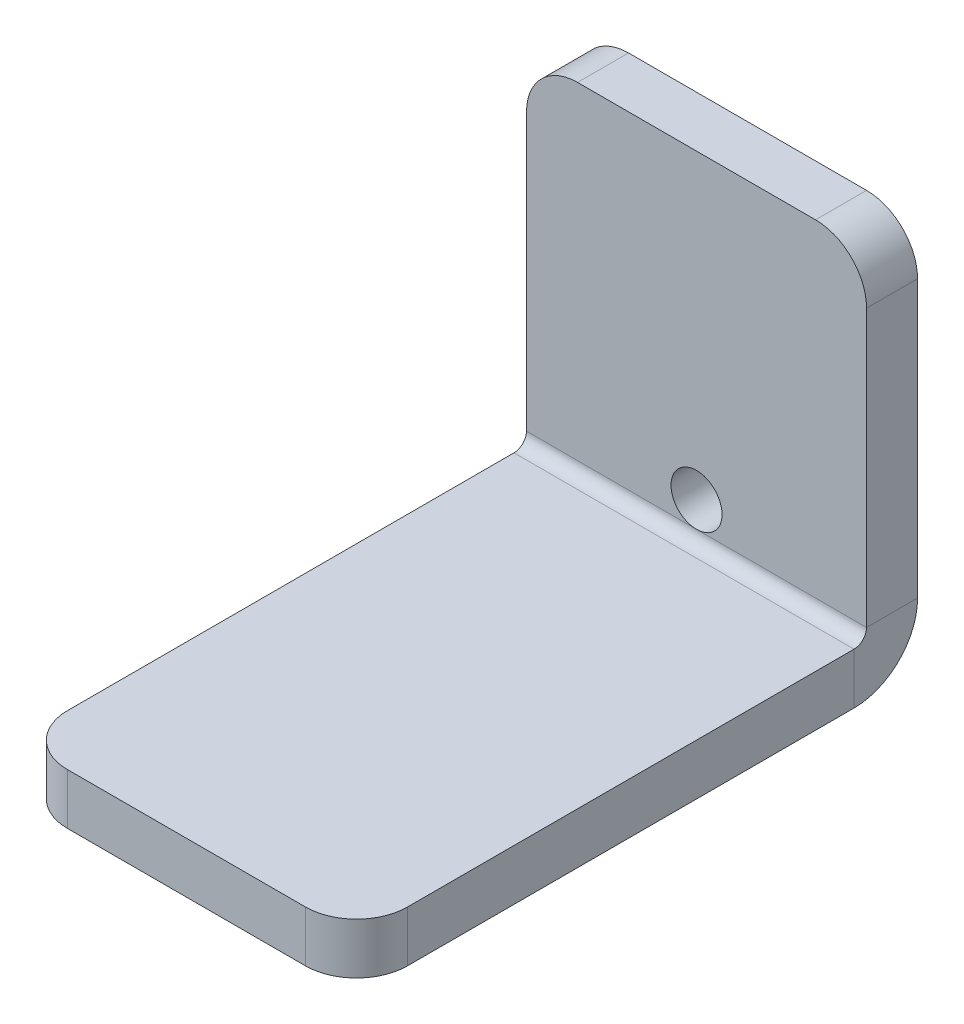
ISO-10303-21;
HEADER;
FILE_DESCRIPTION(('STEP AP214'),'2;1');
FILE_NAME('part.step','',(''),(''),'','','');
FILE_SCHEMA(('AUTOMOTIVE_DESIGN { 1 0 10303 214 1 1 1 1 }'));
ENDSEC;
DATA;
#1=APPLICATION_CONTEXT('core data for automotive mechanical design processes');
#2=APPLICATION_PROTOCOL_DEFINITION('international standard','automotive_design',2000,#1);
#3=PRODUCT_CONTEXT('',#1,'mechanical');
#4=PRODUCT('Part','Part','',(#3));
#5=PRODUCT_RELATED_PRODUCT_CATEGORY('part','',(#4));
#6=PRODUCT_DEFINITION_FORMATION('','',#4);
#7=PRODUCT_DEFINITION_CONTEXT('part definition',#1,'design');
#8=PRODUCT_DEFINITION('design','',#6,#7);
#9=PRODUCT_DEFINITION_SHAPE('','',#8);
#10=(LENGTH_UNIT() NAMED_UNIT(*) SI_UNIT(.MILLI.,.METRE.));
#11=(NAMED_UNIT(*) PLANE_ANGLE_UNIT() SI_UNIT($,.RADIAN.));
#12=(NAMED_UNIT(*) SI_UNIT($,.STERADIAN.) SOLID_ANGLE_UNIT());
#13=UNCERTAINTY_MEASURE_WITH_UNIT(LENGTH_MEASURE(1.E-05),#10,'distance_accuracy_value','');
#14=(GEOMETRIC_REPRESENTATION_CONTEXT(3) GLOBAL_UNCERTAINTY_ASSIGNED_CONTEXT((#13)) GLOBAL_UNIT_ASSIGNED_CONTEXT((#10,
#11,#12)) REPRESENTATION_CONTEXT('',''));
#15=CARTESIAN_POINT('',(0.,0.,0.));
#16=DIRECTION('',(0.,0.,1.));
#17=DIRECTION('',(1.,0.,0.));
#18=AXIS2_PLACEMENT_3D('',#15,#16,#17);
#19=CARTESIAN_POINT('',(20.,0.7366,-30.));
#20=DIRECTION('',(1.,0.,0.));
#21=DIRECTION('',(0.,0.,-1.));
#22=AXIS2_PLACEMENT_3D('',#19,#20,#21);
#23=PLANE('',#22);
#24=DIRECTION('',(0.,0.,-1.));
#25=VECTOR('',#24,1.);
#26=CARTESIAN_POINT('',(20.,0.7366,-30.));
#27=LINE('',#26,#25);
#28=CARTESIAN_POINT('',(20.,0.7366,-30.));
#29=VERTEX_POINT('',#28);
#30=CARTESIAN_POINT('',(20.,0.7366,-33.));
#31=VERTEX_POINT('',#30);
#32=EDGE_CURVE('E138',#29,#31,#27,.T.);
#33=ORIENTED_EDGE('',*,*,#32,.F.);
#34=CARTESIAN_POINT('',(20.,0.7366,-29.2634));
#35=DIRECTION('',(-1.,0.,0.));
#36=DIRECTION('',(0.,0.,1.));
#37=AXIS2_PLACEMENT_3D('',#34,#35,#36);
#38=CIRCLE('',#37,0.7366);
#39=CARTESIAN_POINT('',(20.,0.,-29.2634));
#40=VERTEX_POINT('',#39);
#41=EDGE_CURVE('E142',#40,#29,#38,.F.);
#42=ORIENTED_EDGE('',*,*,#41,.F.);
#43=DIRECTION('',(0.,1.,0.));
#44=VECTOR('',#43,1.);
#45=CARTESIAN_POINT('',(20.,-3.,-29.2634));
#46=LINE('',#45,#44);
#47=CARTESIAN_POINT('',(20.,-3.,-29.2634));
#48=VERTEX_POINT('',#47);
#49=EDGE_CURVE('E151',#48,#40,#46,.T.);
#50=ORIENTED_EDGE('',*,*,#49,.F.);
#51=CARTESIAN_POINT('',(20.,0.7366,-29.2634));
#52=DIRECTION('',(1.,0.,0.));
#53=DIRECTION('',(0.,0.,-1.));
#54=AXIS2_PLACEMENT_3D('',#51,#52,#53);
#55=CIRCLE('',#54,3.7366);
#56=EDGE_CURVE('E144',#48,#31,#55,.T.);
#57=ORIENTED_EDGE('',*,*,#56,.T.);
#58=EDGE_LOOP('',(#33,#42,#50,#57));
#59=FACE_BOUND('',#58,.T.);
#60=ADVANCED_FACE('F45',(#59),#23,.T.);
#61=CARTESIAN_POINT('',(20.,-3.,-29.2634));
#62=DIRECTION('',(1.,0.,0.));
#63=DIRECTION('',(0.,0.,-1.));
#64=AXIS2_PLACEMENT_3D('',#61,#62,#63);
#65=PLANE('',#64);
#66=DIRECTION('',(0.,1.,0.));
#67=VECTOR('',#66,1.);
#68=CARTESIAN_POINT('',(20.,0.,-33.));
#69=LINE('',#68,#67);
#70=CARTESIAN_POINT('',(20.,17.,-33.));
#71=VERTEX_POINT('',#70);
#72=EDGE_CURVE('E169',#31,#71,#69,.T.);
#73=ORIENTED_EDGE('',*,*,#72,.T.);
#74=DIRECTION('',(0.,0.,-1.));
#75=VECTOR('',#74,1.);
#76=CARTESIAN_POINT('',(20.,17.,-29.2634));
#77=LINE('',#76,#75);
#78=CARTESIAN_POINT('',(20.,17.,-30.));
#79=VERTEX_POINT('',#78);
#80=EDGE_CURVE('E11',#71,#79,#77,.F.);
#81=ORIENTED_EDGE('',*,*,#80,.T.);
#82=DIRECTION('',(0.,1.,0.));
#83=VECTOR('',#82,1.);
#84=CARTESIAN_POINT('',(20.,0.,-30.));
#85=LINE('',#84,#83);
#86=EDGE_CURVE('E159',#29,#79,#85,.T.);
#87=ORIENTED_EDGE('',*,*,#86,.F.);
#88=ORIENTED_EDGE('',*,*,#32,.T.);
#89=EDGE_LOOP('',(#73,#81,#87,#88));
#90=FACE_BOUND('',#89,.T.);
#91=ADVANCED_FACE('F166',(#90),#65,.T.);
#92=CARTESIAN_POINT('',(0.,0.,-29.2634));
#93=DIRECTION('',(-1.,0.,0.));
#94=DIRECTION('',(0.,0.,1.));
#95=AXIS2_PLACEMENT_3D('',#92,#93,#94);
#96=PLANE('',#95);
#97=DIRECTION('',(0.,-1.,0.));
#98=VECTOR('',#97,1.);
#99=CARTESIAN_POINT('',(0.,0.,-29.2634));
#100=LINE('',#99,#98);
#101=CARTESIAN_POINT('',(0.,0.,-29.2634));
#102=VERTEX_POINT('',#101);
#103=CARTESIAN_POINT('',(0.,-3.,-29.2634));
#104=VERTEX_POINT('',#103);
#105=EDGE_CURVE('E240',#102,#104,#100,.T.);
#106=ORIENTED_EDGE('',*,*,#105,.F.);
#107=CARTESIAN_POINT('',(0.,0.7366,-29.2634));
#108=DIRECTION('',(-1.,0.,0.));
#109=DIRECTION('',(0.,0.,1.));
#110=AXIS2_PLACEMENT_3D('',#107,#108,#109);
#111=CIRCLE('',#110,0.7366);
#112=CARTESIAN_POINT('',(0.,0.7366,-30.));
#113=VERTEX_POINT('',#112);
#114=EDGE_CURVE('E197',#102,#113,#111,.F.);
#115=ORIENTED_EDGE('',*,*,#114,.T.);
#116=DIRECTION('',(0.,0.,1.));
#117=VECTOR('',#116,1.);
#118=CARTESIAN_POINT('',(0.,0.7366,-33.));
#119=LINE('',#118,#117);
#120=CARTESIAN_POINT('',(0.,0.7366,-33.));
#121=VERTEX_POINT('',#120);
#122=EDGE_CURVE('E236',#121,#113,#119,.T.);
#123=ORIENTED_EDGE('',*,*,#122,.F.);
#124=CARTESIAN_POINT('',(0.,0.7366,-29.2634));
#125=DIRECTION('',(1.,0.,0.));
#126=DIRECTION('',(0.,0.,-1.));
#127=AXIS2_PLACEMENT_3D('',#124,#125,#126);
#128=CIRCLE('',#127,3.7366);
#129=EDGE_CURVE('E207',#104,#121,#128,.T.);
#130=ORIENTED_EDGE('',*,*,#129,.F.);
#131=EDGE_LOOP('',(#106,#115,#123,#130));
#132=FACE_BOUND('',#131,.T.);
#133=ADVANCED_FACE('F327',(#132),#96,.T.);
#134=CARTESIAN_POINT('',(0.,0.7366,-33.));
#135=DIRECTION('',(-1.,0.,0.));
#136=DIRECTION('',(0.,0.,1.));
#137=AXIS2_PLACEMENT_3D('',#134,#135,#136);
#138=PLANE('',#137);
#139=DIRECTION('',(0.,0.,-1.));
#140=VECTOR('',#139,1.);
#141=CARTESIAN_POINT('',(0.,-3.,0.));
#142=LINE('',#141,#140);
#143=CARTESIAN_POINT('',(0.,-3.,-3.));
#144=VERTEX_POINT('',#143);
#145=EDGE_CURVE('E204',#144,#104,#142,.T.);
#146=ORIENTED_EDGE('',*,*,#145,.F.);
#147=DIRECTION('',(0.,1.,0.));
#148=VECTOR('',#147,1.);
#149=CARTESIAN_POINT('',(0.,0.7366,-3.));
#150=LINE('',#149,#148);
#151=CARTESIAN_POINT('',(0.,0.,-3.));
#152=VERTEX_POINT('',#151);
#153=EDGE_CURVE('E269',#144,#152,#150,.T.);
#154=ORIENTED_EDGE('',*,*,#153,.T.);
#155=DIRECTION('',(0.,0.,-1.));
#156=VECTOR('',#155,1.);
#157=CARTESIAN_POINT('',(0.,0.,0.));
#158=LINE('',#157,#156);
#159=EDGE_CURVE('E201',#152,#102,#158,.T.);
#160=ORIENTED_EDGE('',*,*,#159,.T.);
#161=ORIENTED_EDGE('',*,*,#105,.T.);
#162=EDGE_LOOP('',(#146,#154,#160,#161));
#163=FACE_BOUND('',#162,.T.);
#164=ADVANCED_FACE('F318',(#163),#138,.T.);
#165=CARTESIAN_POINT('',(20.,0.,-33.));
#166=DIRECTION('',(0.,0.,1.));
#167=DIRECTION('',(1.,0.,0.));
#168=AXIS2_PLACEMENT_3D('',#165,#166,#167);
#169=PLANE('',#168);
#170=DIRECTION('',(-1.,0.,0.));
#171=VECTOR('',#170,1.);
#172=CARTESIAN_POINT('',(20.,0.7366,-33.));
#173=LINE('',#172,#171);
#174=CARTESIAN_POINT('',(10.,0.7366,-33.));
#175=VERTEX_POINT('',#174);
#176=EDGE_CURVE('E211',#31,#175,#173,.T.);
#177=ORIENTED_EDGE('',*,*,#176,.T.);
#178=CARTESIAN_POINT('',(10.,2.2366,-33.));
#179=DIRECTION('',(0.,0.,-1.));
#180=DIRECTION('',(-1.,0.,0.));
#181=AXIS2_PLACEMENT_3D('',#178,#179,#180);
#182=CIRCLE('',#181,1.5);
#183=EDGE_CURVE('E64',#175,#175,#182,.T.);
#184=ORIENTED_EDGE('',*,*,#183,.F.);
#185=EDGE_CURVE('E188',#175,#121,#173,.T.);
#186=ORIENTED_EDGE('',*,*,#185,.T.);
#187=DIRECTION('',(0.,1.,0.));
#188=VECTOR('',#187,1.);
#189=CARTESIAN_POINT('',(0.,0.,-33.));
#190=LINE('',#189,#188);
#191=CARTESIAN_POINT('',(0.,17.,-33.));
#192=VERTEX_POINT('',#191);
#193=EDGE_CURVE('E189',#121,#192,#190,.T.);
#194=ORIENTED_EDGE('',*,*,#193,.T.);
#195=CARTESIAN_POINT('',(3.,17.,-33.));
#196=DIRECTION('',(0.,0.,1.));
#197=DIRECTION('',(1.,0.,0.));
#198=AXIS2_PLACEMENT_3D('',#195,#196,#197);
#199=CIRCLE('',#198,3.);
#200=CARTESIAN_POINT('',(3.,20.,-33.));
#201=VERTEX_POINT('',#200);
#202=EDGE_CURVE('E253',#192,#201,#199,.F.);
#203=ORIENTED_EDGE('',*,*,#202,.T.);
#204=DIRECTION('',(-1.,0.,0.));
#205=VECTOR('',#204,1.);
#206=CARTESIAN_POINT('',(20.,20.,-33.));
#207=LINE('',#206,#205);
#208=CARTESIAN_POINT('',(17.,20.,-33.));
#209=VERTEX_POINT('',#208);
#210=EDGE_CURVE('E232',#209,#201,#207,.T.);
#211=ORIENTED_EDGE('',*,*,#210,.F.);
#212=CARTESIAN_POINT('',(17.,17.,-33.));
#213=DIRECTION('',(0.,0.,1.));
#214=DIRECTION('',(1.,0.,0.));
#215=AXIS2_PLACEMENT_3D('',#212,#213,#214);
#216=CIRCLE('',#215,3.);
#217=EDGE_CURVE('E250',#209,#71,#216,.F.);
#218=ORIENTED_EDGE('',*,*,#217,.T.);
#219=ORIENTED_EDGE('',*,*,#72,.F.);
#220=EDGE_LOOP('',(#177,#184,#186,#194,#203,#211,#218,#219));
#221=FACE_BOUND('',#220,.T.);
#222=ADVANCED_FACE('F338',(#221),#169,.F.);
#223=CARTESIAN_POINT('',(20.,20.,-30.));
#224=DIRECTION('',(0.,1.,0.));
#225=DIRECTION('',(0.,0.,1.));
#226=AXIS2_PLACEMENT_3D('',#223,#224,#225);
#227=PLANE('',#226);
#228=ORIENTED_EDGE('',*,*,#210,.T.);
#229=DIRECTION('',(0.,0.,-1.));
#230=VECTOR('',#229,1.);
#231=CARTESIAN_POINT('',(3.,20.,-30.));
#232=LINE('',#231,#230);
#233=CARTESIAN_POINT('',(3.,20.,-30.));
#234=VERTEX_POINT('',#233);
#235=EDGE_CURVE('E260',#201,#234,#232,.F.);
#236=ORIENTED_EDGE('',*,*,#235,.T.);
#237=DIRECTION('',(-1.,0.,0.));
#238=VECTOR('',#237,1.);
#239=CARTESIAN_POINT('',(20.,20.,-30.));
#240=LINE('',#239,#238);
#241=CARTESIAN_POINT('',(17.,20.,-30.));
#242=VERTEX_POINT('',#241);
#243=EDGE_CURVE('E163',#242,#234,#240,.T.);
#244=ORIENTED_EDGE('',*,*,#243,.F.);
#245=DIRECTION('',(0.,0.,-1.));
#246=VECTOR('',#245,1.);
#247=CARTESIAN_POINT('',(17.,20.,-30.));
#248=LINE('',#247,#246);
#249=EDGE_CURVE('E256',#242,#209,#248,.T.);
#250=ORIENTED_EDGE('',*,*,#249,.T.);
#251=EDGE_LOOP('',(#228,#236,#244,#250));
#252=FACE_BOUND('',#251,.T.);
#253=ADVANCED_FACE('F351',(#252),#227,.T.);
#254=CARTESIAN_POINT('',(20.,0.,-30.));
#255=DIRECTION('',(0.,0.,1.));
#256=DIRECTION('',(1.,0.,0.));
#257=AXIS2_PLACEMENT_3D('',#254,#255,#256);
#258=PLANE('',#257);
#259=DIRECTION('',(-1.,0.,0.));
#260=VECTOR('',#259,1.);
#261=CARTESIAN_POINT('',(20.,0.7366,-30.));
#262=LINE('',#261,#260);
#263=CARTESIAN_POINT('',(10.,0.7366,-30.));
#264=VERTEX_POINT('',#263);
#265=EDGE_CURVE('E164',#264,#113,#262,.T.);
#266=ORIENTED_EDGE('',*,*,#265,.F.);
#267=CARTESIAN_POINT('',(10.,2.2366,-30.));
#268=DIRECTION('',(0.,0.,1.));
#269=DIRECTION('',(1.,0.,0.));
#270=AXIS2_PLACEMENT_3D('',#267,#268,#269);
#271=CIRCLE('',#270,1.5);
#272=EDGE_CURVE('E59',#264,#264,#271,.T.);
#273=ORIENTED_EDGE('',*,*,#272,.F.);
#274=EDGE_CURVE('E156',#29,#264,#262,.T.);
#275=ORIENTED_EDGE('',*,*,#274,.F.);
#276=ORIENTED_EDGE('',*,*,#86,.T.);
#277=CARTESIAN_POINT('',(17.,17.,-30.));
#278=DIRECTION('',(0.,0.,1.));
#279=DIRECTION('',(1.,0.,0.));
#280=AXIS2_PLACEMENT_3D('',#277,#278,#279);
#281=CIRCLE('',#280,3.);
#282=EDGE_CURVE('E263',#79,#242,#281,.T.);
#283=ORIENTED_EDGE('',*,*,#282,.T.);
#284=ORIENTED_EDGE('',*,*,#243,.T.);
#285=CARTESIAN_POINT('',(3.,17.,-30.));
#286=DIRECTION('',(0.,0.,1.));
#287=DIRECTION('',(1.,0.,0.));
#288=AXIS2_PLACEMENT_3D('',#285,#286,#287);
#289=CIRCLE('',#288,3.);
#290=CARTESIAN_POINT('',(0.,17.,-30.));
#291=VERTEX_POINT('',#290);
#292=EDGE_CURVE('E266',#234,#291,#289,.T.);
#293=ORIENTED_EDGE('',*,*,#292,.T.);
#294=DIRECTION('',(0.,1.,0.));
#295=VECTOR('',#294,1.);
#296=CARTESIAN_POINT('',(0.,0.,-30.));
#297=LINE('',#296,#295);
#298=EDGE_CURVE('E193',#113,#291,#297,.T.);
#299=ORIENTED_EDGE('',*,*,#298,.F.);
#300=EDGE_LOOP('',(#266,#273,#275,#276,#283,#284,#293,#299));
#301=FACE_BOUND('',#300,.T.);
#302=ADVANCED_FACE('F158',(#301),#258,.T.);
#303=CARTESIAN_POINT('',(20.,0.7366,-29.2634));
#304=DIRECTION('',(-1.,0.,0.));
#305=DIRECTION('',(0.,0.,1.));
#306=AXIS2_PLACEMENT_3D('',#303,#304,#305);
#307=CYLINDRICAL_SURFACE('',#306,0.7366);
#308=ORIENTED_EDGE('',*,*,#114,.F.);
#309=DIRECTION('',(-1.,0.,0.));
#310=VECTOR('',#309,1.);
#311=CARTESIAN_POINT('',(20.,0.,-29.2634));
#312=LINE('',#311,#310);
#313=EDGE_CURVE('E175',#40,#102,#312,.T.);
#314=ORIENTED_EDGE('',*,*,#313,.F.);
#315=ORIENTED_EDGE('',*,*,#41,.T.);
#316=ORIENTED_EDGE('',*,*,#274,.T.);
#317=ORIENTED_EDGE('',*,*,#265,.T.);
#318=EDGE_LOOP('',(#308,#314,#315,#316,#317));
#319=FACE_BOUND('',#318,.T.);
#320=ADVANCED_FACE('F173',(#319),#307,.F.);
#321=CARTESIAN_POINT('',(20.,0.,0.));
#322=DIRECTION('',(0.,1.,0.));
#323=DIRECTION('',(0.,0.,1.));
#324=AXIS2_PLACEMENT_3D('',#321,#322,#323);
#325=PLANE('',#324);
#326=ORIENTED_EDGE('',*,*,#159,.F.);
#327=CARTESIAN_POINT('',(3.,0.,-3.));
#328=DIRECTION('',(0.,1.,0.));
#329=DIRECTION('',(0.,0.,1.));
#330=AXIS2_PLACEMENT_3D('',#327,#328,#329);
#331=CIRCLE('',#330,3.);
#332=CARTESIAN_POINT('',(3.,0.,0.));
#333=VERTEX_POINT('',#332);
#334=EDGE_CURVE('E276',#152,#333,#331,.T.);
#335=ORIENTED_EDGE('',*,*,#334,.T.);
#336=DIRECTION('',(-1.,0.,0.));
#337=VECTOR('',#336,1.);
#338=CARTESIAN_POINT('',(20.,0.,0.));
#339=LINE('',#338,#337);
#340=CARTESIAN_POINT('',(17.,0.,0.));
#341=VERTEX_POINT('',#340);
#342=EDGE_CURVE('E223',#341,#333,#339,.T.);
#343=ORIENTED_EDGE('',*,*,#342,.F.);
#344=CARTESIAN_POINT('',(17.,0.,-3.));
#345=DIRECTION('',(0.,1.,0.));
#346=DIRECTION('',(0.,0.,1.));
#347=AXIS2_PLACEMENT_3D('',#344,#345,#346);
#348=CIRCLE('',#347,3.);
#349=CARTESIAN_POINT('',(20.,0.,-3.));
#350=VERTEX_POINT('',#349);
#351=EDGE_CURVE('E273',#341,#350,#348,.T.);
#352=ORIENTED_EDGE('',*,*,#351,.T.);
#353=DIRECTION('',(0.,0.,-1.));
#354=VECTOR('',#353,1.);
#355=CARTESIAN_POINT('',(20.,0.,0.));
#356=LINE('',#355,#354);
#357=EDGE_CURVE('E177',#350,#40,#356,.T.);
#358=ORIENTED_EDGE('',*,*,#357,.T.);
#359=ORIENTED_EDGE('',*,*,#313,.T.);
#360=EDGE_LOOP('',(#326,#335,#343,#352,#358,#359));
#361=FACE_BOUND('',#360,.T.);
#362=ADVANCED_FACE('F311',(#361),#325,.T.);
#363=CARTESIAN_POINT('',(20.,-3.,0.));
#364=DIRECTION('',(0.,0.,1.));
#365=DIRECTION('',(1.,0.,0.));
#366=AXIS2_PLACEMENT_3D('',#363,#364,#365);
#367=PLANE('',#366);
#368=ORIENTED_EDGE('',*,*,#342,.T.);
#369=DIRECTION('',(0.,1.,0.));
#370=VECTOR('',#369,1.);
#371=CARTESIAN_POINT('',(3.,-3.,0.));
#372=LINE('',#371,#370);
#373=CARTESIAN_POINT('',(3.,-3.,0.));
#374=VERTEX_POINT('',#373);
#375=EDGE_CURVE('E283',#333,#374,#372,.F.);
#376=ORIENTED_EDGE('',*,*,#375,.T.);
#377=DIRECTION('',(-1.,0.,0.));
#378=VECTOR('',#377,1.);
#379=CARTESIAN_POINT('',(20.,-3.,0.));
#380=LINE('',#379,#378);
#381=CARTESIAN_POINT('',(17.,-3.,0.));
#382=VERTEX_POINT('',#381);
#383=EDGE_CURVE('E219',#382,#374,#380,.T.);
#384=ORIENTED_EDGE('',*,*,#383,.F.);
#385=DIRECTION('',(0.,1.,0.));
#386=VECTOR('',#385,1.);
#387=CARTESIAN_POINT('',(17.,0.,0.));
#388=LINE('',#387,#386);
#389=EDGE_CURVE('E279',#382,#341,#388,.T.);
#390=ORIENTED_EDGE('',*,*,#389,.T.);
#391=EDGE_LOOP('',(#368,#376,#384,#390));
#392=FACE_BOUND('',#391,.T.);
#393=ADVANCED_FACE('F307',(#392),#367,.T.);
#394=CARTESIAN_POINT('',(20.,-3.,0.));
#395=DIRECTION('',(0.,1.,0.));
#396=DIRECTION('',(0.,0.,1.));
#397=AXIS2_PLACEMENT_3D('',#394,#395,#396);
#398=PLANE('',#397);
#399=ORIENTED_EDGE('',*,*,#383,.T.);
#400=CARTESIAN_POINT('',(3.,-3.,-3.));
#401=DIRECTION('',(0.,1.,0.));
#402=DIRECTION('',(0.,0.,1.));
#403=AXIS2_PLACEMENT_3D('',#400,#401,#402);
#404=CIRCLE('',#403,3.);
#405=EDGE_CURVE('E289',#374,#144,#404,.F.);
#406=ORIENTED_EDGE('',*,*,#405,.T.);
#407=ORIENTED_EDGE('',*,*,#145,.T.);
#408=DIRECTION('',(-1.,0.,0.));
#409=VECTOR('',#408,1.);
#410=CARTESIAN_POINT('',(20.,-3.,-29.2634));
#411=LINE('',#410,#409);
#412=EDGE_CURVE('E215',#48,#104,#411,.T.);
#413=ORIENTED_EDGE('',*,*,#412,.F.);
#414=DIRECTION('',(0.,0.,-1.));
#415=VECTOR('',#414,1.);
#416=CARTESIAN_POINT('',(20.,-3.,0.));
#417=LINE('',#416,#415);
#418=CARTESIAN_POINT('',(20.,-3.,-3.));
#419=VERTEX_POINT('',#418);
#420=EDGE_CURVE('E180',#419,#48,#417,.T.);
#421=ORIENTED_EDGE('',*,*,#420,.F.);
#422=CARTESIAN_POINT('',(17.,-3.,-3.));
#423=DIRECTION('',(0.,1.,0.));
#424=DIRECTION('',(0.,0.,1.));
#425=AXIS2_PLACEMENT_3D('',#422,#423,#424);
#426=CIRCLE('',#425,3.);
#427=EDGE_CURVE('E286',#419,#382,#426,.F.);
#428=ORIENTED_EDGE('',*,*,#427,.T.);
#429=EDGE_LOOP('',(#399,#406,#407,#413,#421,#428));
#430=FACE_BOUND('',#429,.T.);
#431=ADVANCED_FACE('F301',(#430),#398,.F.);
#432=CARTESIAN_POINT('',(20.,0.7366,-29.2634));
#433=DIRECTION('',(-1.,0.,0.));
#434=DIRECTION('',(0.,0.,1.));
#435=AXIS2_PLACEMENT_3D('',#432,#433,#434);
#436=CYLINDRICAL_SURFACE('',#435,3.7366);
#437=ORIENTED_EDGE('',*,*,#129,.T.);
#438=ORIENTED_EDGE('',*,*,#185,.F.);
#439=ORIENTED_EDGE('',*,*,#176,.F.);
#440=ORIENTED_EDGE('',*,*,#56,.F.);
#441=ORIENTED_EDGE('',*,*,#412,.T.);
#442=EDGE_LOOP('',(#437,#438,#439,#440,#441));
#443=FACE_BOUND('',#442,.T.);
#444=ADVANCED_FACE('F323',(#443),#436,.T.);
#445=CARTESIAN_POINT('',(20.,0.7366,-29.2634));
#446=DIRECTION('',(-1.,0.,0.));
#447=DIRECTION('',(0.,0.,1.));
#448=AXIS2_PLACEMENT_3D('',#445,#446,#447);
#449=PLANE('',#448);
#450=ORIENTED_EDGE('',*,*,#357,.F.);
#451=DIRECTION('',(0.,1.,0.));
#452=VECTOR('',#451,1.);
#453=CARTESIAN_POINT('',(20.,-3.,-3.));
#454=LINE('',#453,#452);
#455=EDGE_CURVE('E54',#350,#419,#454,.F.);
#456=ORIENTED_EDGE('',*,*,#455,.T.);
#457=ORIENTED_EDGE('',*,*,#420,.T.);
#458=ORIENTED_EDGE('',*,*,#49,.T.);
#459=EDGE_LOOP('',(#450,#456,#457,#458));
#460=FACE_BOUND('',#459,.T.);
#461=ADVANCED_FACE('F296',(#460),#449,.F.);
#462=CARTESIAN_POINT('',(0.,0.7366,-29.2634));
#463=DIRECTION('',(-1.,0.,0.));
#464=DIRECTION('',(0.,0.,1.));
#465=AXIS2_PLACEMENT_3D('',#462,#463,#464);
#466=PLANE('',#465);
#467=ORIENTED_EDGE('',*,*,#298,.T.);
#468=DIRECTION('',(0.,0.,-1.));
#469=VECTOR('',#468,1.);
#470=CARTESIAN_POINT('',(0.,17.,-29.2634));
#471=LINE('',#470,#469);
#472=EDGE_CURVE('E150',#291,#192,#471,.T.);
#473=ORIENTED_EDGE('',*,*,#472,.T.);
#474=ORIENTED_EDGE('',*,*,#193,.F.);
#475=ORIENTED_EDGE('',*,*,#122,.T.);
#476=EDGE_LOOP('',(#467,#473,#474,#475));
#477=FACE_BOUND('',#476,.T.);
#478=ADVANCED_FACE('F330',(#477),#466,.T.);
#479=CARTESIAN_POINT('',(3.,17.,-29.2634));
#480=DIRECTION('',(0.,0.,-1.));
#481=DIRECTION('',(-1.,0.,0.));
#482=AXIS2_PLACEMENT_3D('',#479,#480,#481);
#483=CYLINDRICAL_SURFACE('',#482,3.);
#484=ORIENTED_EDGE('',*,*,#292,.F.);
#485=ORIENTED_EDGE('',*,*,#235,.F.);
#486=ORIENTED_EDGE('',*,*,#202,.F.);
#487=ORIENTED_EDGE('',*,*,#472,.F.);
#488=EDGE_LOOP('',(#484,#485,#486,#487));
#489=FACE_BOUND('',#488,.T.);
#490=ADVANCED_FACE('F336',(#489),#483,.T.);
#491=CARTESIAN_POINT('',(3.,0.7366,-3.));
#492=DIRECTION('',(0.,1.,0.));
#493=DIRECTION('',(0.,0.,1.));
#494=AXIS2_PLACEMENT_3D('',#491,#492,#493);
#495=CYLINDRICAL_SURFACE('',#494,3.);
#496=ORIENTED_EDGE('',*,*,#405,.F.);
#497=ORIENTED_EDGE('',*,*,#375,.F.);
#498=ORIENTED_EDGE('',*,*,#334,.F.);
#499=ORIENTED_EDGE('',*,*,#153,.F.);
#500=EDGE_LOOP('',(#496,#497,#498,#499));
#501=FACE_BOUND('',#500,.T.);
#502=ADVANCED_FACE('F315',(#501),#495,.T.);
#503=CARTESIAN_POINT('',(17.,-3.,-3.));
#504=DIRECTION('',(0.,-1.,0.));
#505=DIRECTION('',(0.,0.,-1.));
#506=AXIS2_PLACEMENT_3D('',#503,#504,#505);
#507=CYLINDRICAL_SURFACE('',#506,3.);
#508=ORIENTED_EDGE('',*,*,#427,.F.);
#509=ORIENTED_EDGE('',*,*,#455,.F.);
#510=ORIENTED_EDGE('',*,*,#351,.F.);
#511=ORIENTED_EDGE('',*,*,#389,.F.);
#512=EDGE_LOOP('',(#508,#509,#510,#511));
#513=FACE_BOUND('',#512,.T.);
#514=ADVANCED_FACE('F304',(#513),#507,.T.);
#515=CARTESIAN_POINT('',(17.,17.,-30.));
#516=DIRECTION('',(0.,0.,-1.));
#517=DIRECTION('',(-1.,0.,0.));
#518=AXIS2_PLACEMENT_3D('',#515,#516,#517);
#519=CYLINDRICAL_SURFACE('',#518,3.);
#520=ORIENTED_EDGE('',*,*,#282,.F.);
#521=ORIENTED_EDGE('',*,*,#80,.F.);
#522=ORIENTED_EDGE('',*,*,#217,.F.);
#523=ORIENTED_EDGE('',*,*,#249,.F.);
#524=EDGE_LOOP('',(#520,#521,#522,#523));
#525=FACE_BOUND('',#524,.T.);
#526=ADVANCED_FACE('F47',(#525),#519,.T.);
#527=CARTESIAN_POINT('',(10.,2.2366,0.));
#528=DIRECTION('',(0.,0.,-1.));
#529=DIRECTION('',(-1.,0.,0.));
#530=AXIS2_PLACEMENT_3D('',#527,#528,#529);
#531=CYLINDRICAL_SURFACE('',#530,1.5);
#532=ORIENTED_EDGE('',*,*,#272,.T.);
#533=EDGE_LOOP('',(#532));
#534=FACE_BOUND('',#533,.T.);
#535=ORIENTED_EDGE('',*,*,#183,.T.);
#536=EDGE_LOOP('',(#535));
#537=FACE_BOUND('',#536,.T.);
#538=ADVANCED_FACE('F375',(#534,#537),#531,.F.);
#539=CLOSED_SHELL('',(#60,#91,#133,#164,#222,#253,#302,#320,#362,#393,#431,#444,#461,#478,#490,
#502,#514,#526,#538));
#540=MANIFOLD_SOLID_BREP('B2',#539);
#541=ADVANCED_BREP_SHAPE_REPRESENTATION('',(#18,#540),#14);
#542=SHAPE_DEFINITION_REPRESENTATION(#9,#541);
ENDSEC;
END-ISO-10303-21;
